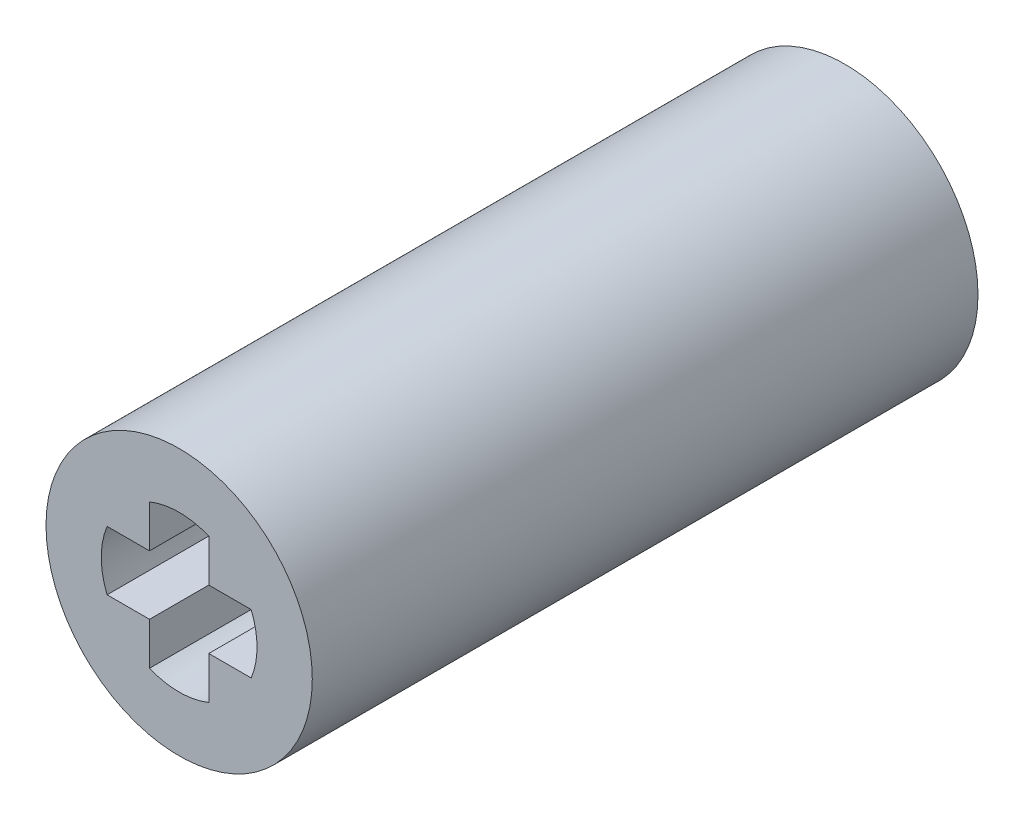
ISO-10303-21;
HEADER;
FILE_DESCRIPTION(('STEP AP214'),'2;1');
FILE_NAME('part.step','',(''),(''),'','','');
FILE_SCHEMA(('AUTOMOTIVE_DESIGN { 1 0 10303 214 1 1 1 1 }'));
ENDSEC;
DATA;
#1=APPLICATION_CONTEXT('core data for automotive mechanical design processes');
#2=APPLICATION_PROTOCOL_DEFINITION('international standard','automotive_design',2000,#1);
#3=PRODUCT_CONTEXT('',#1,'mechanical');
#4=PRODUCT('Part','Part','',(#3));
#5=PRODUCT_RELATED_PRODUCT_CATEGORY('part','',(#4));
#6=PRODUCT_DEFINITION_FORMATION('','',#4);
#7=PRODUCT_DEFINITION_CONTEXT('part definition',#1,'design');
#8=PRODUCT_DEFINITION('design','',#6,#7);
#9=PRODUCT_DEFINITION_SHAPE('','',#8);
#10=(LENGTH_UNIT() NAMED_UNIT(*) SI_UNIT(.MILLI.,.METRE.));
#11=(NAMED_UNIT(*) PLANE_ANGLE_UNIT() SI_UNIT($,.RADIAN.));
#12=(NAMED_UNIT(*) SI_UNIT($,.STERADIAN.) SOLID_ANGLE_UNIT());
#13=UNCERTAINTY_MEASURE_WITH_UNIT(LENGTH_MEASURE(1.E-05),#10,'distance_accuracy_value','');
#14=(GEOMETRIC_REPRESENTATION_CONTEXT(3) GLOBAL_UNCERTAINTY_ASSIGNED_CONTEXT((#13)) GLOBAL_UNIT_ASSIGNED_CONTEXT((#10,
#11,#12)) REPRESENTATION_CONTEXT('',''));
#15=CARTESIAN_POINT('',(0.,0.,0.));
#16=DIRECTION('',(0.,0.,1.));
#17=DIRECTION('',(1.,0.,0.));
#18=AXIS2_PLACEMENT_3D('',#15,#16,#17);
#19=CARTESIAN_POINT('',(0.,0.,0.));
#20=DIRECTION('',(0.,0.,1.));
#21=DIRECTION('',(1.,0.,0.));
#22=AXIS2_PLACEMENT_3D('',#19,#20,#21);
#23=PLANE('',#22);
#24=CARTESIAN_POINT('',(0.,0.,0.));
#25=DIRECTION('',(0.,0.,1.));
#26=DIRECTION('',(1.,0.,0.));
#27=AXIS2_PLACEMENT_3D('',#24,#25,#26);
#28=CIRCLE('',#27,1.5);
#29=CARTESIAN_POINT('',(-1.20743529847359,-0.89,0.));
#30=VERTEX_POINT('',#29);
#31=CARTESIAN_POINT('',(-0.889999999999999,-1.20743529847359,0.));
#32=VERTEX_POINT('',#31);
#33=EDGE_CURVE('E11',#30,#32,#28,.T.);
#34=ORIENTED_EDGE('',*,*,#33,.F.);
#35=DIRECTION('',(1.,0.,0.));
#36=VECTOR('',#35,1.);
#37=CARTESIAN_POINT('',(0.,-0.89,0.));
#38=LINE('',#37,#36);
#39=CARTESIAN_POINT('',(-0.89,-0.89,0.));
#40=VERTEX_POINT('',#39);
#41=EDGE_CURVE('E92',#30,#40,#38,.T.);
#42=ORIENTED_EDGE('',*,*,#41,.T.);
#43=DIRECTION('',(0.,-1.,0.));
#44=VECTOR('',#43,1.);
#45=CARTESIAN_POINT('',(-0.89,0.,0.));
#46=LINE('',#45,#44);
#47=EDGE_CURVE('E137',#40,#32,#46,.T.);
#48=ORIENTED_EDGE('',*,*,#47,.T.);
#49=EDGE_LOOP('',(#34,#42,#48));
#50=FACE_BOUND('',#49,.T.);
#51=ADVANCED_FACE('F42',(#50),#23,.F.);
#52=CARTESIAN_POINT('',(0.889999999999999,-1.20743529847359,0.));
#53=VERTEX_POINT('',#52);
#54=CARTESIAN_POINT('',(1.20743529847359,-0.89,0.));
#55=VERTEX_POINT('',#54);
#56=EDGE_CURVE('E51',#53,#55,#28,.T.);
#57=ORIENTED_EDGE('',*,*,#56,.F.);
#58=DIRECTION('',(0.,1.,0.));
#59=VECTOR('',#58,1.);
#60=CARTESIAN_POINT('',(0.89,0.,0.));
#61=LINE('',#60,#59);
#62=CARTESIAN_POINT('',(0.89,-0.89,0.));
#63=VERTEX_POINT('',#62);
#64=EDGE_CURVE('E188',#53,#63,#61,.T.);
#65=ORIENTED_EDGE('',*,*,#64,.T.);
#66=DIRECTION('',(1.,0.,0.));
#67=VECTOR('',#66,1.);
#68=CARTESIAN_POINT('',(0.,-0.89,0.));
#69=LINE('',#68,#67);
#70=EDGE_CURVE('E185',#63,#55,#69,.T.);
#71=ORIENTED_EDGE('',*,*,#70,.T.);
#72=EDGE_LOOP('',(#57,#65,#71));
#73=FACE_BOUND('',#72,.T.);
#74=ADVANCED_FACE('F274',(#73),#23,.F.);
#75=CARTESIAN_POINT('',(-1.11803398874989,1.,0.));
#76=VERTEX_POINT('',#75);
#77=CARTESIAN_POINT('',(-1.20743529847359,0.89,0.));
#78=VERTEX_POINT('',#77);
#79=EDGE_CURVE('E237',#76,#78,#28,.T.);
#80=ORIENTED_EDGE('',*,*,#79,.F.);
#81=DIRECTION('',(1.,0.,0.));
#82=VECTOR('',#81,1.);
#83=CARTESIAN_POINT('',(0.,1.,0.));
#84=LINE('',#83,#82);
#85=CARTESIAN_POINT('',(-0.89,1.,0.));
#86=VERTEX_POINT('',#85);
#87=EDGE_CURVE('E233',#76,#86,#84,.T.);
#88=ORIENTED_EDGE('',*,*,#87,.T.);
#89=DIRECTION('',(0.,-1.,0.));
#90=VECTOR('',#89,1.);
#91=CARTESIAN_POINT('',(-0.89,0.,0.));
#92=LINE('',#91,#90);
#93=CARTESIAN_POINT('',(-0.89,0.89,0.));
#94=VERTEX_POINT('',#93);
#95=EDGE_CURVE('E167',#86,#94,#92,.T.);
#96=ORIENTED_EDGE('',*,*,#95,.T.);
#97=DIRECTION('',(1.,0.,0.));
#98=VECTOR('',#97,1.);
#99=CARTESIAN_POINT('',(0.,0.89,0.));
#100=LINE('',#99,#98);
#101=EDGE_CURVE('E168',#78,#94,#100,.T.);
#102=ORIENTED_EDGE('',*,*,#101,.F.);
#103=EDGE_LOOP('',(#80,#88,#96,#102));
#104=FACE_BOUND('',#103,.T.);
#105=ADVANCED_FACE('F387',(#104),#23,.F.);
#106=CARTESIAN_POINT('',(1.20743529847359,0.89,0.));
#107=VERTEX_POINT('',#106);
#108=CARTESIAN_POINT('',(1.11803398874989,1.,0.));
#109=VERTEX_POINT('',#108);
#110=EDGE_CURVE('E231',#107,#109,#28,.T.);
#111=ORIENTED_EDGE('',*,*,#110,.F.);
#112=DIRECTION('',(1.,0.,0.));
#113=VECTOR('',#112,1.);
#114=CARTESIAN_POINT('',(0.,0.89,0.));
#115=LINE('',#114,#113);
#116=CARTESIAN_POINT('',(0.89,0.89,0.));
#117=VERTEX_POINT('',#116);
#118=EDGE_CURVE('E182',#117,#107,#115,.T.);
#119=ORIENTED_EDGE('',*,*,#118,.F.);
#120=DIRECTION('',(0.,1.,0.));
#121=VECTOR('',#120,1.);
#122=CARTESIAN_POINT('',(0.89,0.,0.));
#123=LINE('',#122,#121);
#124=CARTESIAN_POINT('',(0.89,1.,0.));
#125=VERTEX_POINT('',#124);
#126=EDGE_CURVE('E178',#117,#125,#123,.T.);
#127=ORIENTED_EDGE('',*,*,#126,.T.);
#128=EDGE_CURVE('E226',#125,#109,#84,.T.);
#129=ORIENTED_EDGE('',*,*,#128,.T.);
#130=EDGE_LOOP('',(#111,#119,#127,#129));
#131=FACE_BOUND('',#130,.T.);
#132=ADVANCED_FACE('F382',(#131),#23,.F.);
#133=CARTESIAN_POINT('',(0.,0.89,10.));
#134=DIRECTION('',(0.,1.,0.));
#135=DIRECTION('',(-1.,0.,0.));
#136=AXIS2_PLACEMENT_3D('',#133,#134,#135);
#137=PLANE('',#136);
#138=CARTESIAN_POINT('',(-2.16413955187737,0.89,0.));
#139=VERTEX_POINT('',#138);
#140=EDGE_CURVE('E164',#139,#78,#100,.T.);
#141=ORIENTED_EDGE('',*,*,#140,.T.);
#142=ORIENTED_EDGE('',*,*,#101,.T.);
#143=DIRECTION('',(0.,0.,-1.));
#144=VECTOR('',#143,1.);
#145=CARTESIAN_POINT('',(-0.89,0.89,10.));
#146=LINE('',#145,#144);
#147=CARTESIAN_POINT('',(-0.89,0.89,10.));
#148=VERTEX_POINT('',#147);
#149=EDGE_CURVE('E46',#148,#94,#146,.T.);
#150=ORIENTED_EDGE('',*,*,#149,.F.);
#151=DIRECTION('',(1.,0.,0.));
#152=VECTOR('',#151,1.);
#153=CARTESIAN_POINT('',(0.,0.89,10.));
#154=LINE('',#153,#152);
#155=CARTESIAN_POINT('',(-2.16413955187737,0.89,10.));
#156=VERTEX_POINT('',#155);
#157=EDGE_CURVE('E100',#156,#148,#154,.T.);
#158=ORIENTED_EDGE('',*,*,#157,.F.);
#159=DIRECTION('',(0.,0.,-1.));
#160=VECTOR('',#159,1.);
#161=CARTESIAN_POINT('',(-2.16413955187737,0.89,10.));
#162=LINE('',#161,#160);
#163=EDGE_CURVE('E69',#156,#139,#162,.T.);
#164=ORIENTED_EDGE('',*,*,#163,.T.);
#165=EDGE_LOOP('',(#141,#142,#150,#158,#164));
#166=FACE_BOUND('',#165,.T.);
#167=ADVANCED_FACE('F44',(#166),#137,.F.);
#168=CARTESIAN_POINT('',(-0.89,0.,10.));
#169=DIRECTION('',(1.,0.,0.));
#170=DIRECTION('',(0.,1.,0.));
#171=AXIS2_PLACEMENT_3D('',#168,#169,#170);
#172=PLANE('',#171);
#173=CARTESIAN_POINT('',(-0.89,2.16413955187737,0.));
#174=VERTEX_POINT('',#173);
#175=EDGE_CURVE('E169',#174,#86,#92,.T.);
#176=ORIENTED_EDGE('',*,*,#175,.F.);
#177=DIRECTION('',(0.,0.,-1.));
#178=VECTOR('',#177,1.);
#179=CARTESIAN_POINT('',(-0.89,2.16413955187737,10.));
#180=LINE('',#179,#178);
#181=CARTESIAN_POINT('',(-0.89,2.16413955187737,10.));
#182=VERTEX_POINT('',#181);
#183=EDGE_CURVE('E218',#182,#174,#180,.T.);
#184=ORIENTED_EDGE('',*,*,#183,.F.);
#185=DIRECTION('',(0.,-1.,0.));
#186=VECTOR('',#185,1.);
#187=CARTESIAN_POINT('',(-0.89,0.,10.));
#188=LINE('',#187,#186);
#189=EDGE_CURVE('E301',#182,#148,#188,.T.);
#190=ORIENTED_EDGE('',*,*,#189,.T.);
#191=ORIENTED_EDGE('',*,*,#149,.T.);
#192=ORIENTED_EDGE('',*,*,#95,.F.);
#193=EDGE_LOOP('',(#176,#184,#190,#191,#192));
#194=FACE_BOUND('',#193,.T.);
#195=ADVANCED_FACE('F395',(#194),#172,.T.);
#196=CARTESIAN_POINT('',(0.,0.,10.));
#197=DIRECTION('',(0.,0.,-1.));
#198=DIRECTION('',(-1.,0.,0.));
#199=AXIS2_PLACEMENT_3D('',#196,#197,#198);
#200=CYLINDRICAL_SURFACE('',#199,2.34);
#201=CARTESIAN_POINT('',(0.,0.,0.));
#202=DIRECTION('',(0.,0.,1.));
#203=DIRECTION('',(1.,0.,0.));
#204=AXIS2_PLACEMENT_3D('',#201,#202,#203);
#205=CIRCLE('',#204,2.34);
#206=CARTESIAN_POINT('',(0.89,2.16413955187737,0.));
#207=VERTEX_POINT('',#206);
#208=EDGE_CURVE('E172',#207,#174,#205,.T.);
#209=ORIENTED_EDGE('',*,*,#208,.F.);
#210=DIRECTION('',(0.,0.,-1.));
#211=VECTOR('',#210,1.);
#212=CARTESIAN_POINT('',(0.89,2.16413955187737,10.));
#213=LINE('',#212,#211);
#214=CARTESIAN_POINT('',(0.89,2.16413955187737,10.));
#215=VERTEX_POINT('',#214);
#216=EDGE_CURVE('E216',#215,#207,#213,.T.);
#217=ORIENTED_EDGE('',*,*,#216,.F.);
#218=CARTESIAN_POINT('',(0.,0.,10.));
#219=DIRECTION('',(0.,0.,1.));
#220=DIRECTION('',(1.,0.,0.));
#221=AXIS2_PLACEMENT_3D('',#218,#219,#220);
#222=CIRCLE('',#221,2.34);
#223=EDGE_CURVE('E159',#215,#182,#222,.T.);
#224=ORIENTED_EDGE('',*,*,#223,.T.);
#225=ORIENTED_EDGE('',*,*,#183,.T.);
#226=EDGE_LOOP('',(#209,#217,#224,#225));
#227=FACE_BOUND('',#226,.T.);
#228=ADVANCED_FACE('F400',(#227),#200,.F.);
#229=CARTESIAN_POINT('',(0.89,0.,10.));
#230=DIRECTION('',(-1.,0.,0.));
#231=DIRECTION('',(0.,-1.,0.));
#232=AXIS2_PLACEMENT_3D('',#229,#230,#231);
#233=PLANE('',#232);
#234=ORIENTED_EDGE('',*,*,#126,.F.);
#235=DIRECTION('',(0.,0.,-1.));
#236=VECTOR('',#235,1.);
#237=CARTESIAN_POINT('',(0.89,0.89,10.));
#238=LINE('',#237,#236);
#239=CARTESIAN_POINT('',(0.89,0.89,10.));
#240=VERTEX_POINT('',#239);
#241=EDGE_CURVE('E214',#240,#117,#238,.T.);
#242=ORIENTED_EDGE('',*,*,#241,.F.);
#243=DIRECTION('',(0.,1.,0.));
#244=VECTOR('',#243,1.);
#245=CARTESIAN_POINT('',(0.89,0.,10.));
#246=LINE('',#245,#244);
#247=EDGE_CURVE('E307',#240,#215,#246,.T.);
#248=ORIENTED_EDGE('',*,*,#247,.T.);
#249=ORIENTED_EDGE('',*,*,#216,.T.);
#250=EDGE_CURVE('E175',#125,#207,#123,.T.);
#251=ORIENTED_EDGE('',*,*,#250,.F.);
#252=EDGE_LOOP('',(#234,#242,#248,#249,#251));
#253=FACE_BOUND('',#252,.T.);
#254=ADVANCED_FACE('F399',(#253),#233,.T.);
#255=CARTESIAN_POINT('',(0.,0.89,10.));
#256=DIRECTION('',(0.,1.,0.));
#257=DIRECTION('',(-1.,0.,0.));
#258=AXIS2_PLACEMENT_3D('',#255,#256,#257);
#259=PLANE('',#258);
#260=ORIENTED_EDGE('',*,*,#118,.T.);
#261=CARTESIAN_POINT('',(2.16413955187737,0.89,0.));
#262=VERTEX_POINT('',#261);
#263=EDGE_CURVE('E181',#107,#262,#115,.T.);
#264=ORIENTED_EDGE('',*,*,#263,.T.);
#265=DIRECTION('',(0.,0.,-1.));
#266=VECTOR('',#265,1.);
#267=CARTESIAN_POINT('',(2.16413955187737,0.89,10.));
#268=LINE('',#267,#266);
#269=CARTESIAN_POINT('',(2.16413955187737,0.89,10.));
#270=VERTEX_POINT('',#269);
#271=EDGE_CURVE('E211',#270,#262,#268,.T.);
#272=ORIENTED_EDGE('',*,*,#271,.F.);
#273=DIRECTION('',(1.,0.,0.));
#274=VECTOR('',#273,1.);
#275=CARTESIAN_POINT('',(0.,0.89,10.));
#276=LINE('',#275,#274);
#277=EDGE_CURVE('E311',#240,#270,#276,.T.);
#278=ORIENTED_EDGE('',*,*,#277,.F.);
#279=ORIENTED_EDGE('',*,*,#241,.T.);
#280=EDGE_LOOP('',(#260,#264,#272,#278,#279));
#281=FACE_BOUND('',#280,.T.);
#282=ADVANCED_FACE('F324',(#281),#259,.F.);
#283=CARTESIAN_POINT('',(2.16413955187737,-0.89,0.));
#284=VERTEX_POINT('',#283);
#285=EDGE_CURVE('E177',#284,#262,#205,.T.);
#286=ORIENTED_EDGE('',*,*,#285,.F.);
#287=DIRECTION('',(0.,0.,-1.));
#288=VECTOR('',#287,1.);
#289=CARTESIAN_POINT('',(2.16413955187737,-0.89,10.));
#290=LINE('',#289,#288);
#291=CARTESIAN_POINT('',(2.16413955187737,-0.89,10.));
#292=VERTEX_POINT('',#291);
#293=EDGE_CURVE('E208',#292,#284,#290,.T.);
#294=ORIENTED_EDGE('',*,*,#293,.F.);
#295=EDGE_CURVE('E308',#292,#270,#222,.T.);
#296=ORIENTED_EDGE('',*,*,#295,.T.);
#297=ORIENTED_EDGE('',*,*,#271,.T.);
#298=EDGE_LOOP('',(#286,#294,#296,#297));
#299=FACE_BOUND('',#298,.T.);
#300=ADVANCED_FACE('F318',(#299),#200,.F.);
#301=CARTESIAN_POINT('',(0.,-0.89,10.));
#302=DIRECTION('',(0.,1.,0.));
#303=DIRECTION('',(-1.,0.,0.));
#304=AXIS2_PLACEMENT_3D('',#301,#302,#303);
#305=PLANE('',#304);
#306=ORIENTED_EDGE('',*,*,#70,.F.);
#307=DIRECTION('',(0.,0.,-1.));
#308=VECTOR('',#307,1.);
#309=CARTESIAN_POINT('',(0.89,-0.89,10.));
#310=LINE('',#309,#308);
#311=CARTESIAN_POINT('',(0.89,-0.89,10.));
#312=VERTEX_POINT('',#311);
#313=EDGE_CURVE('E205',#312,#63,#310,.T.);
#314=ORIENTED_EDGE('',*,*,#313,.F.);
#315=DIRECTION('',(1.,0.,0.));
#316=VECTOR('',#315,1.);
#317=CARTESIAN_POINT('',(0.,-0.89,10.));
#318=LINE('',#317,#316);
#319=EDGE_CURVE('E313',#312,#292,#318,.T.);
#320=ORIENTED_EDGE('',*,*,#319,.T.);
#321=ORIENTED_EDGE('',*,*,#293,.T.);
#322=EDGE_CURVE('E189',#55,#284,#69,.T.);
#323=ORIENTED_EDGE('',*,*,#322,.F.);
#324=EDGE_LOOP('',(#306,#314,#320,#321,#323));
#325=FACE_BOUND('',#324,.T.);
#326=ADVANCED_FACE('F285',(#325),#305,.T.);
#327=CARTESIAN_POINT('',(0.89,0.,10.));
#328=DIRECTION('',(-1.,0.,0.));
#329=DIRECTION('',(0.,-1.,0.));
#330=AXIS2_PLACEMENT_3D('',#327,#328,#329);
#331=PLANE('',#330);
#332=CARTESIAN_POINT('',(0.889999999999999,-2.16413955187737,0.));
#333=VERTEX_POINT('',#332);
#334=EDGE_CURVE('E190',#333,#53,#61,.T.);
#335=ORIENTED_EDGE('',*,*,#334,.F.);
#336=DIRECTION('',(0.,0.,-1.));
#337=VECTOR('',#336,1.);
#338=CARTESIAN_POINT('',(0.889999999999999,-2.16413955187737,10.));
#339=LINE('',#338,#337);
#340=CARTESIAN_POINT('',(0.889999999999999,-2.16413955187737,10.));
#341=VERTEX_POINT('',#340);
#342=EDGE_CURVE('E202',#341,#333,#339,.T.);
#343=ORIENTED_EDGE('',*,*,#342,.F.);
#344=DIRECTION('',(0.,1.,0.));
#345=VECTOR('',#344,1.);
#346=CARTESIAN_POINT('',(0.89,0.,10.));
#347=LINE('',#346,#345);
#348=EDGE_CURVE('E281',#341,#312,#347,.T.);
#349=ORIENTED_EDGE('',*,*,#348,.T.);
#350=ORIENTED_EDGE('',*,*,#313,.T.);
#351=ORIENTED_EDGE('',*,*,#64,.F.);
#352=EDGE_LOOP('',(#335,#343,#349,#350,#351));
#353=FACE_BOUND('',#352,.T.);
#354=ADVANCED_FACE('F278',(#353),#331,.T.);
#355=CARTESIAN_POINT('',(-0.889999999999999,-2.16413955187737,0.));
#356=VERTEX_POINT('',#355);
#357=EDGE_CURVE('E193',#356,#333,#205,.T.);
#358=ORIENTED_EDGE('',*,*,#357,.F.);
#359=DIRECTION('',(0.,0.,-1.));
#360=VECTOR('',#359,1.);
#361=CARTESIAN_POINT('',(-0.889999999999999,-2.16413955187737,10.));
#362=LINE('',#361,#360);
#363=CARTESIAN_POINT('',(-0.889999999999999,-2.16413955187737,10.));
#364=VERTEX_POINT('',#363);
#365=EDGE_CURVE('E140',#364,#356,#362,.T.);
#366=ORIENTED_EDGE('',*,*,#365,.F.);
#367=EDGE_CURVE('E150',#364,#341,#222,.T.);
#368=ORIENTED_EDGE('',*,*,#367,.T.);
#369=ORIENTED_EDGE('',*,*,#342,.T.);
#370=EDGE_LOOP('',(#358,#366,#368,#369));
#371=FACE_BOUND('',#370,.T.);
#372=ADVANCED_FACE('F415',(#371),#200,.F.);
#373=CARTESIAN_POINT('',(-0.89,0.,10.));
#374=DIRECTION('',(1.,0.,0.));
#375=DIRECTION('',(0.,1.,0.));
#376=AXIS2_PLACEMENT_3D('',#373,#374,#375);
#377=PLANE('',#376);
#378=ORIENTED_EDGE('',*,*,#47,.F.);
#379=DIRECTION('',(0.,0.,-1.));
#380=VECTOR('',#379,1.);
#381=CARTESIAN_POINT('',(-0.89,-0.89,10.));
#382=LINE('',#381,#380);
#383=CARTESIAN_POINT('',(-0.89,-0.89,10.));
#384=VERTEX_POINT('',#383);
#385=EDGE_CURVE('E131',#384,#40,#382,.T.);
#386=ORIENTED_EDGE('',*,*,#385,.F.);
#387=DIRECTION('',(0.,-1.,0.));
#388=VECTOR('',#387,1.);
#389=CARTESIAN_POINT('',(-0.89,0.,10.));
#390=LINE('',#389,#388);
#391=EDGE_CURVE('E135',#384,#364,#390,.T.);
#392=ORIENTED_EDGE('',*,*,#391,.T.);
#393=ORIENTED_EDGE('',*,*,#365,.T.);
#394=EDGE_CURVE('E195',#32,#356,#46,.T.);
#395=ORIENTED_EDGE('',*,*,#394,.F.);
#396=EDGE_LOOP('',(#378,#386,#392,#393,#395));
#397=FACE_BOUND('',#396,.T.);
#398=ADVANCED_FACE('F133',(#397),#377,.T.);
#399=CARTESIAN_POINT('',(0.,-0.89,10.));
#400=DIRECTION('',(0.,1.,0.));
#401=DIRECTION('',(-1.,0.,0.));
#402=AXIS2_PLACEMENT_3D('',#399,#400,#401);
#403=PLANE('',#402);
#404=CARTESIAN_POINT('',(-2.16413955187737,-0.89,0.));
#405=VERTEX_POINT('',#404);
#406=EDGE_CURVE('E196',#405,#30,#38,.T.);
#407=ORIENTED_EDGE('',*,*,#406,.F.);
#408=DIRECTION('',(0.,0.,-1.));
#409=VECTOR('',#408,1.);
#410=CARTESIAN_POINT('',(-2.16413955187737,-0.89,10.));
#411=LINE('',#410,#409);
#412=CARTESIAN_POINT('',(-2.16413955187737,-0.89,10.));
#413=VERTEX_POINT('',#412);
#414=EDGE_CURVE('E141',#413,#405,#411,.T.);
#415=ORIENTED_EDGE('',*,*,#414,.F.);
#416=DIRECTION('',(1.,0.,0.));
#417=VECTOR('',#416,1.);
#418=CARTESIAN_POINT('',(0.,-0.89,10.));
#419=LINE('',#418,#417);
#420=EDGE_CURVE('E147',#413,#384,#419,.T.);
#421=ORIENTED_EDGE('',*,*,#420,.T.);
#422=ORIENTED_EDGE('',*,*,#385,.T.);
#423=ORIENTED_EDGE('',*,*,#41,.F.);
#424=EDGE_LOOP('',(#407,#415,#421,#422,#423));
#425=FACE_BOUND('',#424,.T.);
#426=ADVANCED_FACE('F153',(#425),#403,.T.);
#427=EDGE_CURVE('E176',#139,#405,#205,.T.);
#428=ORIENTED_EDGE('',*,*,#427,.F.);
#429=ORIENTED_EDGE('',*,*,#163,.F.);
#430=EDGE_CURVE('E155',#156,#413,#222,.T.);
#431=ORIENTED_EDGE('',*,*,#430,.T.);
#432=ORIENTED_EDGE('',*,*,#414,.T.);
#433=EDGE_LOOP('',(#428,#429,#431,#432));
#434=FACE_BOUND('',#433,.T.);
#435=ADVANCED_FACE('F343',(#434),#200,.F.);
#436=CARTESIAN_POINT('',(0.,0.,10.));
#437=DIRECTION('',(0.,0.,-1.));
#438=DIRECTION('',(-1.,0.,0.));
#439=AXIS2_PLACEMENT_3D('',#436,#437,#438);
#440=CYLINDRICAL_SURFACE('',#439,4.);
#441=CARTESIAN_POINT('',(0.,0.,10.));
#442=DIRECTION('',(0.,0.,1.));
#443=DIRECTION('',(1.,0.,0.));
#444=AXIS2_PLACEMENT_3D('',#441,#442,#443);
#445=CIRCLE('',#444,4.);
#446=CARTESIAN_POINT('',(4.,0.,10.));
#447=VERTEX_POINT('',#446);
#448=EDGE_CURVE('E157',#447,#447,#445,.T.);
#449=ORIENTED_EDGE('',*,*,#448,.F.);
#450=EDGE_LOOP('',(#449));
#451=FACE_BOUND('',#450,.T.);
#452=CARTESIAN_POINT('',(0.,0.,-10.));
#453=DIRECTION('',(0.,0.,1.));
#454=DIRECTION('',(1.,0.,0.));
#455=AXIS2_PLACEMENT_3D('',#452,#453,#454);
#456=CIRCLE('',#455,4.);
#457=CARTESIAN_POINT('',(4.,0.,-10.));
#458=VERTEX_POINT('',#457);
#459=EDGE_CURVE('E361',#458,#458,#456,.T.);
#460=ORIENTED_EDGE('',*,*,#459,.T.);
#461=EDGE_LOOP('',(#460));
#462=FACE_BOUND('',#461,.T.);
#463=ADVANCED_FACE('F370',(#451,#462),#440,.T.);
#464=CARTESIAN_POINT('',(0.,0.,10.));
#465=DIRECTION('',(0.,0.,1.));
#466=DIRECTION('',(1.,0.,0.));
#467=AXIS2_PLACEMENT_3D('',#464,#465,#466);
#468=PLANE('',#467);
#469=ORIENTED_EDGE('',*,*,#157,.T.);
#470=ORIENTED_EDGE('',*,*,#189,.F.);
#471=ORIENTED_EDGE('',*,*,#223,.F.);
#472=ORIENTED_EDGE('',*,*,#247,.F.);
#473=ORIENTED_EDGE('',*,*,#277,.T.);
#474=ORIENTED_EDGE('',*,*,#295,.F.);
#475=ORIENTED_EDGE('',*,*,#319,.F.);
#476=ORIENTED_EDGE('',*,*,#348,.F.);
#477=ORIENTED_EDGE('',*,*,#367,.F.);
#478=ORIENTED_EDGE('',*,*,#391,.F.);
#479=ORIENTED_EDGE('',*,*,#420,.F.);
#480=ORIENTED_EDGE('',*,*,#430,.F.);
#481=EDGE_LOOP('',(#469,#470,#471,#472,#473,#474,#475,#476,#477,#478,#479,#480));
#482=FACE_BOUND('',#481,.T.);
#483=ORIENTED_EDGE('',*,*,#448,.T.);
#484=EDGE_LOOP('',(#483));
#485=FACE_BOUND('',#484,.T.);
#486=ADVANCED_FACE('F145',(#482,#485),#468,.T.);
#487=CARTESIAN_POINT('',(0.,0.,0.));
#488=DIRECTION('',(0.,0.,1.));
#489=DIRECTION('',(1.,0.,0.));
#490=AXIS2_PLACEMENT_3D('',#487,#488,#489);
#491=PLANE('',#490);
#492=ORIENTED_EDGE('',*,*,#140,.F.);
#493=ORIENTED_EDGE('',*,*,#427,.T.);
#494=ORIENTED_EDGE('',*,*,#406,.T.);
#495=EDGE_CURVE('E53',#78,#30,#28,.T.);
#496=ORIENTED_EDGE('',*,*,#495,.F.);
#497=EDGE_LOOP('',(#492,#493,#494,#496));
#498=FACE_BOUND('',#497,.T.);
#499=ADVANCED_FACE('F340',(#498),#491,.T.);
#500=EDGE_CURVE('E255',#32,#53,#28,.T.);
#501=ORIENTED_EDGE('',*,*,#500,.F.);
#502=ORIENTED_EDGE('',*,*,#394,.T.);
#503=ORIENTED_EDGE('',*,*,#357,.T.);
#504=ORIENTED_EDGE('',*,*,#334,.T.);
#505=EDGE_LOOP('',(#501,#502,#503,#504));
#506=FACE_BOUND('',#505,.T.);
#507=ADVANCED_FACE('F428',(#506),#491,.T.);
#508=EDGE_CURVE('E248',#55,#107,#28,.T.);
#509=ORIENTED_EDGE('',*,*,#508,.F.);
#510=ORIENTED_EDGE('',*,*,#322,.T.);
#511=ORIENTED_EDGE('',*,*,#285,.T.);
#512=ORIENTED_EDGE('',*,*,#263,.F.);
#513=EDGE_LOOP('',(#509,#510,#511,#512));
#514=FACE_BOUND('',#513,.T.);
#515=ADVANCED_FACE('F328',(#514),#491,.T.);
#516=CARTESIAN_POINT('',(0.,0.,-10.));
#517=DIRECTION('',(0.,0.,1.));
#518=DIRECTION('',(1.,0.,0.));
#519=AXIS2_PLACEMENT_3D('',#516,#517,#518);
#520=CYLINDRICAL_SURFACE('',#519,1.5);
#521=ORIENTED_EDGE('',*,*,#79,.T.);
#522=ORIENTED_EDGE('',*,*,#495,.T.);
#523=ORIENTED_EDGE('',*,*,#33,.T.);
#524=ORIENTED_EDGE('',*,*,#500,.T.);
#525=ORIENTED_EDGE('',*,*,#56,.T.);
#526=ORIENTED_EDGE('',*,*,#508,.T.);
#527=ORIENTED_EDGE('',*,*,#110,.T.);
#528=DIRECTION('',(0.,0.,1.));
#529=VECTOR('',#528,1.);
#530=CARTESIAN_POINT('',(1.11803398874989,1.,-10.));
#531=LINE('',#530,#529);
#532=CARTESIAN_POINT('',(1.11803398874989,1.,-10.));
#533=VERTEX_POINT('',#532);
#534=EDGE_CURVE('E60',#533,#109,#531,.T.);
#535=ORIENTED_EDGE('',*,*,#534,.F.);
#536=CARTESIAN_POINT('',(0.,0.,-10.));
#537=DIRECTION('',(0.,0.,1.));
#538=DIRECTION('',(1.,0.,0.));
#539=AXIS2_PLACEMENT_3D('',#536,#537,#538);
#540=CIRCLE('',#539,1.5);
#541=CARTESIAN_POINT('',(-1.11803398874989,1.,-10.));
#542=VERTEX_POINT('',#541);
#543=EDGE_CURVE('E240',#542,#533,#540,.T.);
#544=ORIENTED_EDGE('',*,*,#543,.F.);
#545=DIRECTION('',(0.,0.,1.));
#546=VECTOR('',#545,1.);
#547=CARTESIAN_POINT('',(-1.11803398874989,1.,-10.));
#548=LINE('',#547,#546);
#549=EDGE_CURVE('E305',#542,#76,#548,.T.);
#550=ORIENTED_EDGE('',*,*,#549,.T.);
#551=EDGE_LOOP('',(#521,#522,#523,#524,#525,#526,#527,#535,#544,#550));
#552=FACE_BOUND('',#551,.T.);
#553=ADVANCED_FACE('F265',(#552),#520,.F.);
#554=CARTESIAN_POINT('',(0.,1.,-10.));
#555=DIRECTION('',(0.,-1.,0.));
#556=DIRECTION('',(0.,0.,-1.));
#557=AXIS2_PLACEMENT_3D('',#554,#555,#556);
#558=PLANE('',#557);
#559=ORIENTED_EDGE('',*,*,#87,.F.);
#560=ORIENTED_EDGE('',*,*,#549,.F.);
#561=DIRECTION('',(1.,0.,0.));
#562=VECTOR('',#561,1.);
#563=CARTESIAN_POINT('',(0.,1.,-10.));
#564=LINE('',#563,#562);
#565=EDGE_CURVE('E360',#542,#533,#564,.T.);
#566=ORIENTED_EDGE('',*,*,#565,.T.);
#567=ORIENTED_EDGE('',*,*,#534,.T.);
#568=ORIENTED_EDGE('',*,*,#128,.F.);
#569=EDGE_CURVE('E234',#86,#125,#84,.T.);
#570=ORIENTED_EDGE('',*,*,#569,.F.);
#571=EDGE_LOOP('',(#559,#560,#566,#567,#568,#570));
#572=FACE_BOUND('',#571,.T.);
#573=ADVANCED_FACE('F358',(#572),#558,.T.);
#574=CARTESIAN_POINT('',(0.,0.,-10.));
#575=DIRECTION('',(0.,0.,1.));
#576=DIRECTION('',(1.,0.,0.));
#577=AXIS2_PLACEMENT_3D('',#574,#575,#576);
#578=PLANE('',#577);
#579=ORIENTED_EDGE('',*,*,#543,.T.);
#580=ORIENTED_EDGE('',*,*,#565,.F.);
#581=EDGE_LOOP('',(#579,#580));
#582=FACE_BOUND('',#581,.T.);
#583=ORIENTED_EDGE('',*,*,#459,.F.);
#584=EDGE_LOOP('',(#583));
#585=FACE_BOUND('',#584,.T.);
#586=ADVANCED_FACE('F364',(#582,#585),#578,.F.);
#587=ORIENTED_EDGE('',*,*,#569,.T.);
#588=ORIENTED_EDGE('',*,*,#250,.T.);
#589=ORIENTED_EDGE('',*,*,#208,.T.);
#590=ORIENTED_EDGE('',*,*,#175,.T.);
#591=EDGE_LOOP('',(#587,#588,#589,#590));
#592=FACE_BOUND('',#591,.T.);
#593=ADVANCED_FACE('F372',(#592),#491,.T.);
#594=CLOSED_SHELL('',(#51,#74,#105,#132,#167,#195,#228,#254,#282,#300,#326,#354,#372,#398,#426,
#435,#463,#486,#499,#507,#515,#553,#573,#586,#593));
#595=MANIFOLD_SOLID_BREP('B2',#594);
#596=ADVANCED_BREP_SHAPE_REPRESENTATION('',(#18,#595),#14);
#597=SHAPE_DEFINITION_REPRESENTATION(#9,#596);
ENDSEC;
END-ISO-10303-21;
